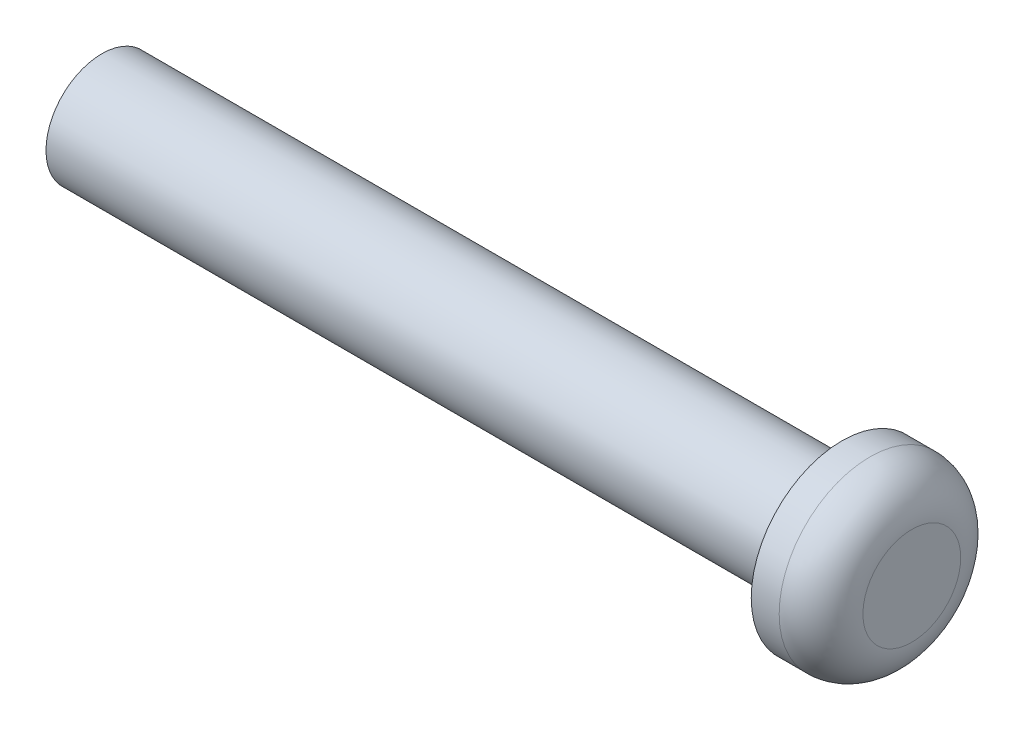
ISO-10303-21;
HEADER;
FILE_DESCRIPTION(('STEP AP214'),'2;1');
FILE_NAME('part.step','',(''),(''),'','','');
FILE_SCHEMA(('AUTOMOTIVE_DESIGN { 1 0 10303 214 1 1 1 1 }'));
ENDSEC;
DATA;
#1=APPLICATION_CONTEXT('core data for automotive mechanical design processes');
#2=APPLICATION_PROTOCOL_DEFINITION('international standard','automotive_design',2000,#1);
#3=PRODUCT_CONTEXT('',#1,'mechanical');
#4=PRODUCT('Part','Part','',(#3));
#5=PRODUCT_RELATED_PRODUCT_CATEGORY('part','',(#4));
#6=PRODUCT_DEFINITION_FORMATION('','',#4);
#7=PRODUCT_DEFINITION_CONTEXT('part definition',#1,'design');
#8=PRODUCT_DEFINITION('design','',#6,#7);
#9=PRODUCT_DEFINITION_SHAPE('','',#8);
#10=(LENGTH_UNIT() NAMED_UNIT(*) SI_UNIT(.MILLI.,.METRE.));
#11=(NAMED_UNIT(*) PLANE_ANGLE_UNIT() SI_UNIT($,.RADIAN.));
#12=(NAMED_UNIT(*) SI_UNIT($,.STERADIAN.) SOLID_ANGLE_UNIT());
#13=UNCERTAINTY_MEASURE_WITH_UNIT(LENGTH_MEASURE(1.E-05),#10,'distance_accuracy_value','');
#14=(GEOMETRIC_REPRESENTATION_CONTEXT(3) GLOBAL_UNCERTAINTY_ASSIGNED_CONTEXT((#13)) GLOBAL_UNIT_ASSIGNED_CONTEXT((#10,
#11,#12)) REPRESENTATION_CONTEXT('',''));
#15=CARTESIAN_POINT('',(0.,0.,0.));
#16=DIRECTION('',(0.,0.,1.));
#17=DIRECTION('',(1.,0.,0.));
#18=AXIS2_PLACEMENT_3D('',#15,#16,#17);
#19=CARTESIAN_POINT('',(0.,0.,0.));
#20=DIRECTION('',(1.,0.,0.));
#21=DIRECTION('',(0.,0.,-1.));
#22=AXIS2_PLACEMENT_3D('',#19,#20,#21);
#23=PLANE('',#22);
#24=CARTESIAN_POINT('',(0.,0.,0.));
#25=DIRECTION('',(1.,0.,0.));
#26=DIRECTION('',(0.,0.,-1.));
#27=AXIS2_PLACEMENT_3D('',#24,#25,#26);
#28=CIRCLE('',#27,6.5);
#29=CARTESIAN_POINT('',(0.,0.,-6.5));
#30=VERTEX_POINT('',#29);
#31=EDGE_CURVE('E46',#30,#30,#28,.T.);
#32=ORIENTED_EDGE('',*,*,#31,.F.);
#33=EDGE_LOOP('',(#32));
#34=FACE_BOUND('',#33,.T.);
#35=CARTESIAN_POINT('',(0.,0.,0.));
#36=DIRECTION('',(1.,0.,0.));
#37=DIRECTION('',(0.,0.,-1.));
#38=AXIS2_PLACEMENT_3D('',#35,#36,#37);
#39=CIRCLE('',#38,4.);
#40=CARTESIAN_POINT('',(0.,0.,-4.));
#41=VERTEX_POINT('',#40);
#42=EDGE_CURVE('E42',#41,#41,#39,.F.);
#43=ORIENTED_EDGE('',*,*,#42,.F.);
#44=EDGE_LOOP('',(#43));
#45=FACE_BOUND('',#44,.T.);
#46=ADVANCED_FACE('F31',(#34,#45),#23,.F.);
#47=CARTESIAN_POINT('',(5.,0.,0.));
#48=DIRECTION('',(-1.,0.,0.));
#49=DIRECTION('',(0.,0.,1.));
#50=AXIS2_PLACEMENT_3D('',#47,#48,#49);
#51=CYLINDRICAL_SURFACE('',#50,6.5);
#52=CARTESIAN_POINT('',(2.,0.,0.));
#53=DIRECTION('',(1.,0.,0.));
#54=DIRECTION('',(0.,0.,-1.));
#55=AXIS2_PLACEMENT_3D('',#52,#53,#54);
#56=CIRCLE('',#55,6.5);
#57=CARTESIAN_POINT('',(2.,0.,-6.5));
#58=VERTEX_POINT('',#57);
#59=EDGE_CURVE('E10',#58,#58,#56,.F.);
#60=ORIENTED_EDGE('',*,*,#59,.T.);
#61=EDGE_LOOP('',(#60));
#62=FACE_BOUND('',#61,.T.);
#63=ORIENTED_EDGE('',*,*,#31,.T.);
#64=EDGE_LOOP('',(#63));
#65=FACE_BOUND('',#64,.T.);
#66=ADVANCED_FACE('F65',(#62,#65),#51,.T.);
#67=CARTESIAN_POINT('',(5.,0.,0.));
#68=DIRECTION('',(1.,0.,0.));
#69=DIRECTION('',(0.,0.,-1.));
#70=AXIS2_PLACEMENT_3D('',#67,#68,#69);
#71=PLANE('',#70);
#72=CARTESIAN_POINT('',(5.,0.,0.));
#73=DIRECTION('',(1.,0.,0.));
#74=DIRECTION('',(0.,0.,-1.));
#75=AXIS2_PLACEMENT_3D('',#72,#73,#74);
#76=CIRCLE('',#75,3.5);
#77=CARTESIAN_POINT('',(5.,0.,-3.5));
#78=VERTEX_POINT('',#77);
#79=EDGE_CURVE('E38',#78,#78,#76,.T.);
#80=ORIENTED_EDGE('',*,*,#79,.T.);
#81=EDGE_LOOP('',(#80));
#82=FACE_BOUND('',#81,.T.);
#83=ADVANCED_FACE('F60',(#82),#71,.T.);
#84=CARTESIAN_POINT('',(-53.,0.,0.));
#85=DIRECTION('',(1.,0.,0.));
#86=DIRECTION('',(0.,0.,-1.));
#87=AXIS2_PLACEMENT_3D('',#84,#85,#86);
#88=CYLINDRICAL_SURFACE('',#87,4.);
#89=CARTESIAN_POINT('',(-53.,0.,0.));
#90=DIRECTION('',(-1.,0.,0.));
#91=DIRECTION('',(0.,0.,1.));
#92=AXIS2_PLACEMENT_3D('',#89,#90,#91);
#93=CIRCLE('',#92,4.);
#94=CARTESIAN_POINT('',(-53.,0.,4.));
#95=VERTEX_POINT('',#94);
#96=EDGE_CURVE('E51',#95,#95,#93,.T.);
#97=ORIENTED_EDGE('',*,*,#96,.F.);
#98=EDGE_LOOP('',(#97));
#99=FACE_BOUND('',#98,.T.);
#100=ORIENTED_EDGE('',*,*,#42,.T.);
#101=EDGE_LOOP('',(#100));
#102=FACE_BOUND('',#101,.T.);
#103=ADVANCED_FACE('F57',(#99,#102),#88,.T.);
#104=CARTESIAN_POINT('',(-53.,0.,0.));
#105=DIRECTION('',(-1.,0.,0.));
#106=DIRECTION('',(0.,0.,1.));
#107=AXIS2_PLACEMENT_3D('',#104,#105,#106);
#108=PLANE('',#107);
#109=ORIENTED_EDGE('',*,*,#96,.T.);
#110=EDGE_LOOP('',(#109));
#111=FACE_BOUND('',#110,.T.);
#112=ADVANCED_FACE('F55',(#111),#108,.T.);
#113=CARTESIAN_POINT('',(2.,0.,0.));
#114=DIRECTION('',(1.,0.,0.));
#115=DIRECTION('',(0.,0.,-1.));
#116=AXIS2_PLACEMENT_3D('',#113,#114,#115);
#117=TOROIDAL_SURFACE('',#116,3.5,3.);
#118=ORIENTED_EDGE('',*,*,#59,.F.);
#119=EDGE_LOOP('',(#118));
#120=FACE_BOUND('',#119,.T.);
#121=ORIENTED_EDGE('',*,*,#79,.F.);
#122=EDGE_LOOP('',(#121));
#123=FACE_BOUND('',#122,.T.);
#124=ADVANCED_FACE('F33',(#120,#123),#117,.T.);
#125=CLOSED_SHELL('',(#46,#66,#83,#103,#112,#124));
#126=MANIFOLD_SOLID_BREP('B2',#125);
#127=ADVANCED_BREP_SHAPE_REPRESENTATION('',(#18,#126),#14);
#128=SHAPE_DEFINITION_REPRESENTATION(#9,#127);
ENDSEC;
END-ISO-10303-21;
